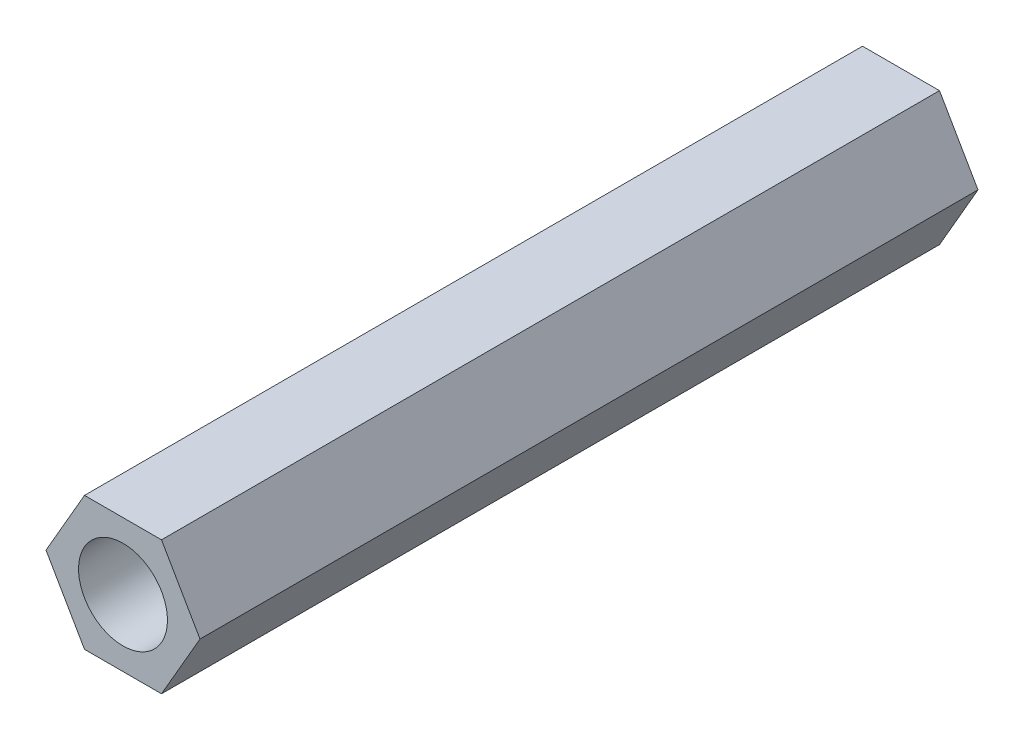
ISO-10303-21;
HEADER;
FILE_DESCRIPTION(('STEP AP214'),'2;1');
FILE_NAME('part.step','',(''),(''),'','','');
FILE_SCHEMA(('AUTOMOTIVE_DESIGN { 1 0 10303 214 1 1 1 1 }'));
ENDSEC;
DATA;
#1=APPLICATION_CONTEXT('core data for automotive mechanical design processes');
#2=APPLICATION_PROTOCOL_DEFINITION('international standard','automotive_design',2000,#1);
#3=PRODUCT_CONTEXT('',#1,'mechanical');
#4=PRODUCT('Part','Part','',(#3));
#5=PRODUCT_RELATED_PRODUCT_CATEGORY('part','',(#4));
#6=PRODUCT_DEFINITION_FORMATION('','',#4);
#7=PRODUCT_DEFINITION_CONTEXT('part definition',#1,'design');
#8=PRODUCT_DEFINITION('design','',#6,#7);
#9=PRODUCT_DEFINITION_SHAPE('','',#8);
#10=(LENGTH_UNIT() NAMED_UNIT(*) SI_UNIT(.MILLI.,.METRE.));
#11=(NAMED_UNIT(*) PLANE_ANGLE_UNIT() SI_UNIT($,.RADIAN.));
#12=(NAMED_UNIT(*) SI_UNIT($,.STERADIAN.) SOLID_ANGLE_UNIT());
#13=UNCERTAINTY_MEASURE_WITH_UNIT(LENGTH_MEASURE(1.E-05),#10,'distance_accuracy_value','');
#14=(GEOMETRIC_REPRESENTATION_CONTEXT(3) GLOBAL_UNCERTAINTY_ASSIGNED_CONTEXT((#13)) GLOBAL_UNIT_ASSIGNED_CONTEXT((#10,
#11,#12)) REPRESENTATION_CONTEXT('',''));
#15=CARTESIAN_POINT('',(0.,0.,0.));
#16=DIRECTION('',(0.,0.,1.));
#17=DIRECTION('',(1.,0.,0.));
#18=AXIS2_PLACEMENT_3D('',#15,#16,#17);
#19=CARTESIAN_POINT('',(0.,0.,35.));
#20=DIRECTION('',(0.,0.,1.));
#21=DIRECTION('',(1.,0.,0.));
#22=AXIS2_PLACEMENT_3D('',#19,#20,#21);
#23=PLANE('',#22);
#24=DIRECTION('',(0.499999999999995,0.866025403784442,0.));
#25=VECTOR('',#24,1.);
#26=CARTESIAN_POINT('',(1.73205080756891,-2.99999999999997,35.));
#27=LINE('',#26,#25);
#28=CARTESIAN_POINT('',(1.73205080756891,-2.99999999999997,35.));
#29=VERTEX_POINT('',#28);
#30=CARTESIAN_POINT('',(3.46410161513774,0.,35.));
#31=VERTEX_POINT('',#30);
#32=EDGE_CURVE('E132',#29,#31,#27,.T.);
#33=ORIENTED_EDGE('',*,*,#32,.T.);
#34=DIRECTION('',(-0.500000000000001,0.866025403784438,0.));
#35=VECTOR('',#34,1.);
#36=CARTESIAN_POINT('',(3.46410161513774,0.,35.));
#37=LINE('',#36,#35);
#38=CARTESIAN_POINT('',(1.73205080756886,2.99999999999999,35.));
#39=VERTEX_POINT('',#38);
#40=EDGE_CURVE('E90',#31,#39,#37,.T.);
#41=ORIENTED_EDGE('',*,*,#40,.T.);
#42=DIRECTION('',(-1.,0.,0.));
#43=VECTOR('',#42,1.);
#44=CARTESIAN_POINT('',(1.73205080756886,2.99999999999999,35.));
#45=LINE('',#44,#43);
#46=CARTESIAN_POINT('',(-1.73205080756888,2.99999999999998,35.));
#47=VERTEX_POINT('',#46);
#48=EDGE_CURVE('E103',#39,#47,#45,.T.);
#49=ORIENTED_EDGE('',*,*,#48,.T.);
#50=DIRECTION('',(-0.499999999999995,-0.866025403784442,0.));
#51=VECTOR('',#50,1.);
#52=CARTESIAN_POINT('',(-1.73205080756888,2.99999999999998,35.));
#53=LINE('',#52,#51);
#54=CARTESIAN_POINT('',(-3.46410161513774,0.,35.));
#55=VERTEX_POINT('',#54);
#56=EDGE_CURVE('E97',#47,#55,#53,.T.);
#57=ORIENTED_EDGE('',*,*,#56,.T.);
#58=DIRECTION('',(0.500000000000007,-0.866025403784435,0.));
#59=VECTOR('',#58,1.);
#60=CARTESIAN_POINT('',(-3.46410161513774,0.,35.));
#61=LINE('',#60,#59);
#62=CARTESIAN_POINT('',(-1.73205080756884,-3.,35.));
#63=VERTEX_POINT('',#62);
#64=EDGE_CURVE('E101',#55,#63,#61,.T.);
#65=ORIENTED_EDGE('',*,*,#64,.T.);
#66=DIRECTION('',(1.,0.,0.));
#67=VECTOR('',#66,1.);
#68=CARTESIAN_POINT('',(-1.73205080756884,-3.,35.));
#69=LINE('',#68,#67);
#70=EDGE_CURVE('E53',#63,#29,#69,.T.);
#71=ORIENTED_EDGE('',*,*,#70,.T.);
#72=EDGE_LOOP('',(#33,#41,#49,#57,#65,#71));
#73=FACE_BOUND('',#72,.T.);
#74=CARTESIAN_POINT('',(0.,0.,35.));
#75=DIRECTION('',(0.,0.,1.));
#76=DIRECTION('',(1.,0.,0.));
#77=AXIS2_PLACEMENT_3D('',#74,#75,#76);
#78=CIRCLE('',#77,2.);
#79=CARTESIAN_POINT('',(2.,0.,35.));
#80=VERTEX_POINT('',#79);
#81=EDGE_CURVE('E125',#80,#80,#78,.T.);
#82=ORIENTED_EDGE('',*,*,#81,.F.);
#83=EDGE_LOOP('',(#82));
#84=FACE_BOUND('',#83,.T.);
#85=ADVANCED_FACE('F36',(#73,#84),#23,.T.);
#86=CARTESIAN_POINT('',(0.,0.,0.));
#87=DIRECTION('',(0.,0.,1.));
#88=DIRECTION('',(1.,0.,0.));
#89=AXIS2_PLACEMENT_3D('',#86,#87,#88);
#90=PLANE('',#89);
#91=DIRECTION('',(0.499999999999995,0.866025403784442,0.));
#92=VECTOR('',#91,1.);
#93=CARTESIAN_POINT('',(1.73205080756891,-2.99999999999997,0.));
#94=LINE('',#93,#92);
#95=CARTESIAN_POINT('',(1.73205080756891,-2.99999999999997,0.));
#96=VERTEX_POINT('',#95);
#97=CARTESIAN_POINT('',(3.46410161513774,0.,0.));
#98=VERTEX_POINT('',#97);
#99=EDGE_CURVE('E121',#96,#98,#94,.T.);
#100=ORIENTED_EDGE('',*,*,#99,.F.);
#101=DIRECTION('',(1.,0.,0.));
#102=VECTOR('',#101,1.);
#103=CARTESIAN_POINT('',(-1.73205080756884,-3.,0.));
#104=LINE('',#103,#102);
#105=CARTESIAN_POINT('',(-1.73205080756884,-3.,0.));
#106=VERTEX_POINT('',#105);
#107=EDGE_CURVE('E82',#106,#96,#104,.T.);
#108=ORIENTED_EDGE('',*,*,#107,.F.);
#109=DIRECTION('',(0.500000000000007,-0.866025403784435,0.));
#110=VECTOR('',#109,1.);
#111=CARTESIAN_POINT('',(-3.46410161513774,0.,0.));
#112=LINE('',#111,#110);
#113=CARTESIAN_POINT('',(-3.46410161513774,0.,0.));
#114=VERTEX_POINT('',#113);
#115=EDGE_CURVE('E76',#114,#106,#112,.T.);
#116=ORIENTED_EDGE('',*,*,#115,.F.);
#117=DIRECTION('',(-0.499999999999995,-0.866025403784442,0.));
#118=VECTOR('',#117,1.);
#119=CARTESIAN_POINT('',(-1.73205080756888,2.99999999999998,0.));
#120=LINE('',#119,#118);
#121=CARTESIAN_POINT('',(-1.73205080756888,2.99999999999998,0.));
#122=VERTEX_POINT('',#121);
#123=EDGE_CURVE('E111',#122,#114,#120,.T.);
#124=ORIENTED_EDGE('',*,*,#123,.F.);
#125=DIRECTION('',(-1.,0.,0.));
#126=VECTOR('',#125,1.);
#127=CARTESIAN_POINT('',(1.73205080756886,2.99999999999999,0.));
#128=LINE('',#127,#126);
#129=CARTESIAN_POINT('',(1.73205080756886,2.99999999999999,0.));
#130=VERTEX_POINT('',#129);
#131=EDGE_CURVE('E127',#130,#122,#128,.T.);
#132=ORIENTED_EDGE('',*,*,#131,.F.);
#133=DIRECTION('',(-0.500000000000001,0.866025403784438,0.));
#134=VECTOR('',#133,1.);
#135=CARTESIAN_POINT('',(3.46410161513774,0.,0.));
#136=LINE('',#135,#134);
#137=EDGE_CURVE('E124',#98,#130,#136,.T.);
#138=ORIENTED_EDGE('',*,*,#137,.F.);
#139=EDGE_LOOP('',(#100,#108,#116,#124,#132,#138));
#140=FACE_BOUND('',#139,.T.);
#141=CARTESIAN_POINT('',(0.,0.,0.));
#142=DIRECTION('',(0.,0.,1.));
#143=DIRECTION('',(1.,0.,0.));
#144=AXIS2_PLACEMENT_3D('',#141,#142,#143);
#145=CIRCLE('',#144,2.);
#146=CARTESIAN_POINT('',(2.,0.,0.));
#147=VERTEX_POINT('',#146);
#148=EDGE_CURVE('E227',#147,#147,#145,.T.);
#149=ORIENTED_EDGE('',*,*,#148,.T.);
#150=EDGE_LOOP('',(#149));
#151=FACE_BOUND('',#150,.T.);
#152=ADVANCED_FACE('F141',(#140,#151),#90,.F.);
#153=CARTESIAN_POINT('',(1.73205080756891,-2.99999999999997,35.));
#154=DIRECTION('',(-0.866025403784442,0.499999999999995,0.));
#155=DIRECTION('',(-0.499999999999995,-0.866025403784442,0.));
#156=AXIS2_PLACEMENT_3D('',#153,#154,#155);
#157=PLANE('',#156);
#158=ORIENTED_EDGE('',*,*,#99,.T.);
#159=DIRECTION('',(0.,0.,-1.));
#160=VECTOR('',#159,1.);
#161=CARTESIAN_POINT('',(3.46410161513774,0.,35.));
#162=LINE('',#161,#160);
#163=EDGE_CURVE('E11',#31,#98,#162,.T.);
#164=ORIENTED_EDGE('',*,*,#163,.F.);
#165=ORIENTED_EDGE('',*,*,#32,.F.);
#166=DIRECTION('',(0.,0.,-1.));
#167=VECTOR('',#166,1.);
#168=CARTESIAN_POINT('',(1.73205080756891,-2.99999999999997,35.));
#169=LINE('',#168,#167);
#170=EDGE_CURVE('E117',#29,#96,#169,.T.);
#171=ORIENTED_EDGE('',*,*,#170,.T.);
#172=EDGE_LOOP('',(#158,#164,#165,#171));
#173=FACE_BOUND('',#172,.T.);
#174=ADVANCED_FACE('F38',(#173),#157,.F.);
#175=CARTESIAN_POINT('',(3.46410161513774,0.,35.));
#176=DIRECTION('',(-0.866025403784438,-0.500000000000001,0.));
#177=DIRECTION('',(0.500000000000001,-0.866025403784438,0.));
#178=AXIS2_PLACEMENT_3D('',#175,#176,#177);
#179=PLANE('',#178);
#180=ORIENTED_EDGE('',*,*,#137,.T.);
#181=DIRECTION('',(0.,0.,-1.));
#182=VECTOR('',#181,1.);
#183=CARTESIAN_POINT('',(1.73205080756886,2.99999999999999,35.));
#184=LINE('',#183,#182);
#185=EDGE_CURVE('E45',#39,#130,#184,.T.);
#186=ORIENTED_EDGE('',*,*,#185,.F.);
#187=ORIENTED_EDGE('',*,*,#40,.F.);
#188=ORIENTED_EDGE('',*,*,#163,.T.);
#189=EDGE_LOOP('',(#180,#186,#187,#188));
#190=FACE_BOUND('',#189,.T.);
#191=ADVANCED_FACE('F166',(#190),#179,.F.);
#192=CARTESIAN_POINT('',(1.73205080756886,2.99999999999999,35.));
#193=DIRECTION('',(0.,-1.,0.));
#194=DIRECTION('',(1.,0.,0.));
#195=AXIS2_PLACEMENT_3D('',#192,#193,#194);
#196=PLANE('',#195);
#197=ORIENTED_EDGE('',*,*,#131,.T.);
#198=DIRECTION('',(0.,0.,-1.));
#199=VECTOR('',#198,1.);
#200=CARTESIAN_POINT('',(-1.73205080756888,2.99999999999998,35.));
#201=LINE('',#200,#199);
#202=EDGE_CURVE('E112',#47,#122,#201,.T.);
#203=ORIENTED_EDGE('',*,*,#202,.F.);
#204=ORIENTED_EDGE('',*,*,#48,.F.);
#205=ORIENTED_EDGE('',*,*,#185,.T.);
#206=EDGE_LOOP('',(#197,#203,#204,#205));
#207=FACE_BOUND('',#206,.T.);
#208=ADVANCED_FACE('F138',(#207),#196,.F.);
#209=CARTESIAN_POINT('',(-1.73205080756888,2.99999999999998,35.));
#210=DIRECTION('',(0.866025403784441,-0.499999999999995,0.));
#211=DIRECTION('',(0.499999999999995,0.866025403784442,0.));
#212=AXIS2_PLACEMENT_3D('',#209,#210,#211);
#213=PLANE('',#212);
#214=ORIENTED_EDGE('',*,*,#123,.T.);
#215=DIRECTION('',(0.,0.,-1.));
#216=VECTOR('',#215,1.);
#217=CARTESIAN_POINT('',(-3.46410161513774,0.,35.));
#218=LINE('',#217,#216);
#219=EDGE_CURVE('E108',#55,#114,#218,.T.);
#220=ORIENTED_EDGE('',*,*,#219,.F.);
#221=ORIENTED_EDGE('',*,*,#56,.F.);
#222=ORIENTED_EDGE('',*,*,#202,.T.);
#223=EDGE_LOOP('',(#214,#220,#221,#222));
#224=FACE_BOUND('',#223,.T.);
#225=ADVANCED_FACE('F109',(#224),#213,.F.);
#226=CARTESIAN_POINT('',(-3.46410161513774,0.,35.));
#227=DIRECTION('',(0.866025403784435,0.500000000000007,0.));
#228=DIRECTION('',(-0.500000000000007,0.866025403784435,0.));
#229=AXIS2_PLACEMENT_3D('',#226,#227,#228);
#230=PLANE('',#229);
#231=ORIENTED_EDGE('',*,*,#115,.T.);
#232=DIRECTION('',(0.,0.,-1.));
#233=VECTOR('',#232,1.);
#234=CARTESIAN_POINT('',(-1.73205080756884,-3.,35.));
#235=LINE('',#234,#233);
#236=EDGE_CURVE('E113',#63,#106,#235,.T.);
#237=ORIENTED_EDGE('',*,*,#236,.F.);
#238=ORIENTED_EDGE('',*,*,#64,.F.);
#239=ORIENTED_EDGE('',*,*,#219,.T.);
#240=EDGE_LOOP('',(#231,#237,#238,#239));
#241=FACE_BOUND('',#240,.T.);
#242=ADVANCED_FACE('F115',(#241),#230,.F.);
#243=CARTESIAN_POINT('',(-1.73205080756884,-3.,35.));
#244=DIRECTION('',(0.,1.,0.));
#245=DIRECTION('',(-1.,0.,0.));
#246=AXIS2_PLACEMENT_3D('',#243,#244,#245);
#247=PLANE('',#246);
#248=ORIENTED_EDGE('',*,*,#107,.T.);
#249=ORIENTED_EDGE('',*,*,#170,.F.);
#250=ORIENTED_EDGE('',*,*,#70,.F.);
#251=ORIENTED_EDGE('',*,*,#236,.T.);
#252=EDGE_LOOP('',(#248,#249,#250,#251));
#253=FACE_BOUND('',#252,.T.);
#254=ADVANCED_FACE('F146',(#253),#247,.F.);
#255=CARTESIAN_POINT('',(0.,0.,35.));
#256=DIRECTION('',(0.,0.,-1.));
#257=DIRECTION('',(-1.,0.,0.));
#258=AXIS2_PLACEMENT_3D('',#255,#256,#257);
#259=CYLINDRICAL_SURFACE('',#258,2.);
#260=ORIENTED_EDGE('',*,*,#81,.T.);
#261=EDGE_LOOP('',(#260));
#262=FACE_BOUND('',#261,.T.);
#263=ORIENTED_EDGE('',*,*,#148,.F.);
#264=EDGE_LOOP('',(#263));
#265=FACE_BOUND('',#264,.T.);
#266=ADVANCED_FACE('F148',(#262,#265),#259,.F.);
#267=CLOSED_SHELL('',(#85,#152,#174,#191,#208,#225,#242,#254,#266));
#268=MANIFOLD_SOLID_BREP('B2',#267);
#269=ADVANCED_BREP_SHAPE_REPRESENTATION('',(#18,#268),#14);
#270=SHAPE_DEFINITION_REPRESENTATION(#9,#269);
ENDSEC;
END-ISO-10303-21;
